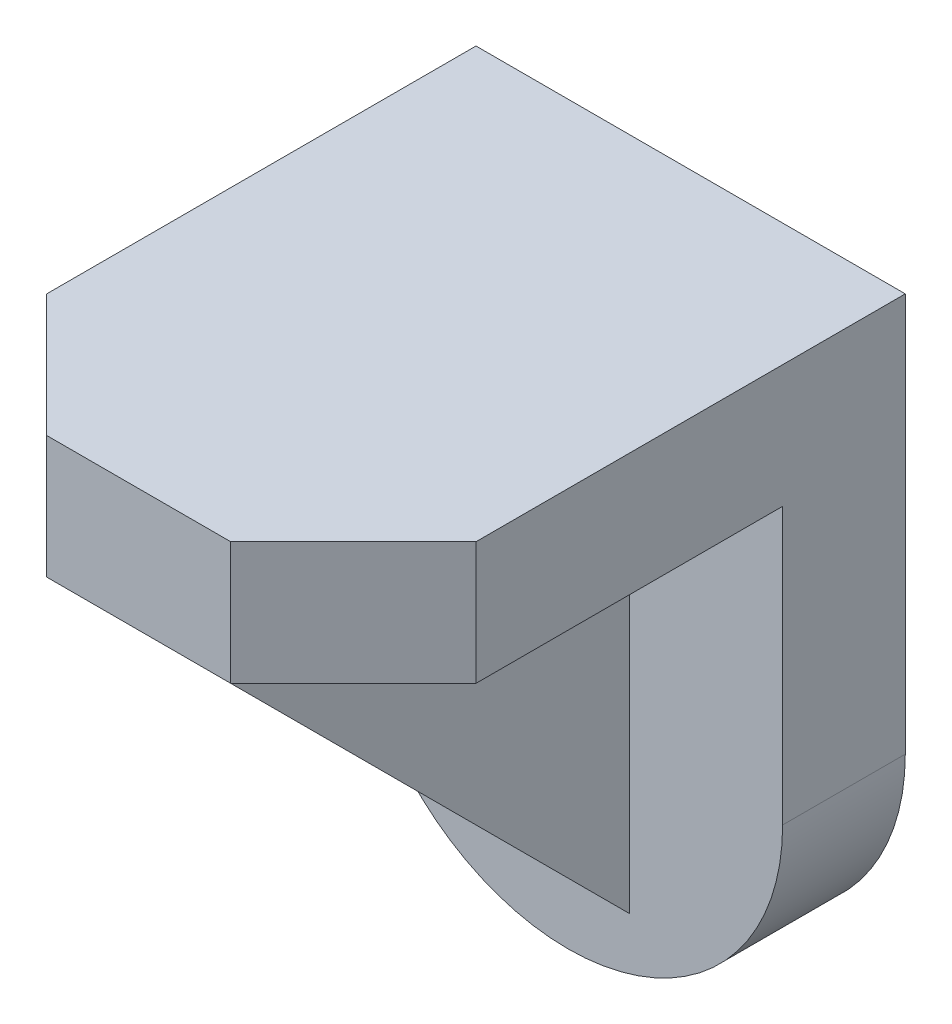
ISO-10303-21;
HEADER;
FILE_DESCRIPTION(('STEP AP214'),'2;1');
FILE_NAME('part.step','',(''),(''),'','','');
FILE_SCHEMA(('AUTOMOTIVE_DESIGN { 1 0 10303 214 1 1 1 1 }'));
ENDSEC;
DATA;
#1=APPLICATION_CONTEXT('core data for automotive mechanical design processes');
#2=APPLICATION_PROTOCOL_DEFINITION('international standard','automotive_design',2000,#1);
#3=PRODUCT_CONTEXT('',#1,'mechanical');
#4=PRODUCT('Part','Part','',(#3));
#5=PRODUCT_RELATED_PRODUCT_CATEGORY('part','',(#4));
#6=PRODUCT_DEFINITION_FORMATION('','',#4);
#7=PRODUCT_DEFINITION_CONTEXT('part definition',#1,'design');
#8=PRODUCT_DEFINITION('design','',#6,#7);
#9=PRODUCT_DEFINITION_SHAPE('','',#8);
#10=(LENGTH_UNIT() NAMED_UNIT(*) SI_UNIT(.MILLI.,.METRE.));
#11=(NAMED_UNIT(*) PLANE_ANGLE_UNIT() SI_UNIT($,.RADIAN.));
#12=(NAMED_UNIT(*) SI_UNIT($,.STERADIAN.) SOLID_ANGLE_UNIT());
#13=UNCERTAINTY_MEASURE_WITH_UNIT(LENGTH_MEASURE(1.E-05),#10,'distance_accuracy_value','');
#14=(GEOMETRIC_REPRESENTATION_CONTEXT(3) GLOBAL_UNCERTAINTY_ASSIGNED_CONTEXT((#13)) GLOBAL_UNIT_ASSIGNED_CONTEXT((#10,
#11,#12)) REPRESENTATION_CONTEXT('',''));
#15=CARTESIAN_POINT('',(0.,0.,0.));
#16=DIRECTION('',(0.,0.,1.));
#17=DIRECTION('',(1.,0.,0.));
#18=AXIS2_PLACEMENT_3D('',#15,#16,#17);
#19=CARTESIAN_POINT('',(0.,0.,0.));
#20=DIRECTION('',(0.,1.,0.));
#21=DIRECTION('',(0.,0.,1.));
#22=AXIS2_PLACEMENT_3D('',#19,#20,#21);
#23=PLANE('',#22);
#24=DIRECTION('',(0.,0.,1.));
#25=VECTOR('',#24,1.);
#26=CARTESIAN_POINT('',(6.,0.,27.));
#27=LINE('',#26,#25);
#28=CARTESIAN_POINT('',(6.,0.,-15.));
#29=VERTEX_POINT('',#28);
#30=CARTESIAN_POINT('',(6.,0.,27.));
#31=VERTEX_POINT('',#30);
#32=EDGE_CURVE('E128',#29,#31,#27,.T.);
#33=ORIENTED_EDGE('',*,*,#32,.F.);
#34=DIRECTION('',(1.,0.,0.));
#35=VECTOR('',#34,1.);
#36=CARTESIAN_POINT('',(21.,0.,-15.));
#37=LINE('',#36,#35);
#38=CARTESIAN_POINT('',(21.,0.,-15.));
#39=VERTEX_POINT('',#38);
#40=EDGE_CURVE('E62',#29,#39,#37,.T.);
#41=ORIENTED_EDGE('',*,*,#40,.T.);
#42=DIRECTION('',(0.,0.,-1.));
#43=VECTOR('',#42,1.);
#44=CARTESIAN_POINT('',(21.,0.,-27.));
#45=LINE('',#44,#43);
#46=CARTESIAN_POINT('',(21.,0.,14.9999999999999));
#47=VERTEX_POINT('',#46);
#48=EDGE_CURVE('E168',#47,#39,#45,.T.);
#49=ORIENTED_EDGE('',*,*,#48,.F.);
#50=DIRECTION('',(0.707106781186548,0.,-0.707106781186548));
#51=VECTOR('',#50,1.);
#52=CARTESIAN_POINT('',(21.,0.,14.9999999999999));
#53=LINE('',#52,#51);
#54=CARTESIAN_POINT('',(8.99999999999994,0.,27.));
#55=VERTEX_POINT('',#54);
#56=EDGE_CURVE('E199',#47,#55,#53,.F.);
#57=ORIENTED_EDGE('',*,*,#56,.T.);
#58=DIRECTION('',(1.,0.,0.));
#59=VECTOR('',#58,1.);
#60=CARTESIAN_POINT('',(-21.,0.,27.));
#61=LINE('',#60,#59);
#62=EDGE_CURVE('E187',#31,#55,#61,.T.);
#63=ORIENTED_EDGE('',*,*,#62,.F.);
#64=EDGE_LOOP('',(#33,#41,#49,#57,#63));
#65=FACE_BOUND('',#64,.T.);
#66=ADVANCED_FACE('F38',(#65),#23,.F.);
#67=CARTESIAN_POINT('',(0.,-27.,-15.));
#68=DIRECTION('',(0.,0.,-1.));
#69=DIRECTION('',(-1.,0.,0.));
#70=AXIS2_PLACEMENT_3D('',#67,#68,#69);
#71=PLANE('',#70);
#72=DIRECTION('',(0.,1.,0.));
#73=VECTOR('',#72,1.);
#74=CARTESIAN_POINT('',(6.,-42.,-15.));
#75=LINE('',#74,#73);
#76=CARTESIAN_POINT('',(6.,-42.,-15.));
#77=VERTEX_POINT('',#76);
#78=EDGE_CURVE('E127',#77,#29,#75,.T.);
#79=ORIENTED_EDGE('',*,*,#78,.F.);
#80=DIRECTION('',(-1.,0.,0.));
#81=VECTOR('',#80,1.);
#82=CARTESIAN_POINT('',(6.,-42.,-15.));
#83=LINE('',#82,#81);
#84=CARTESIAN_POINT('',(-6.,-42.,-15.));
#85=VERTEX_POINT('',#84);
#86=EDGE_CURVE('E134',#77,#85,#83,.T.);
#87=ORIENTED_EDGE('',*,*,#86,.T.);
#88=DIRECTION('',(0.,1.,0.));
#89=VECTOR('',#88,1.);
#90=CARTESIAN_POINT('',(-6.,-42.,-15.));
#91=LINE('',#90,#89);
#92=CARTESIAN_POINT('',(-5.99999999999999,0.,-15.));
#93=VERTEX_POINT('',#92);
#94=EDGE_CURVE('E146',#85,#93,#91,.T.);
#95=ORIENTED_EDGE('',*,*,#94,.T.);
#96=CARTESIAN_POINT('',(-21.,0.,-15.));
#97=VERTEX_POINT('',#96);
#98=EDGE_CURVE('E150',#97,#93,#37,.T.);
#99=ORIENTED_EDGE('',*,*,#98,.F.);
#100=DIRECTION('',(0.,1.,0.));
#101=VECTOR('',#100,1.);
#102=CARTESIAN_POINT('',(-21.,0.,-15.));
#103=LINE('',#102,#101);
#104=CARTESIAN_POINT('',(-21.,-27.,-15.));
#105=VERTEX_POINT('',#104);
#106=EDGE_CURVE('E159',#105,#97,#103,.T.);
#107=ORIENTED_EDGE('',*,*,#106,.F.);
#108=CARTESIAN_POINT('',(0.,-27.,-15.));
#109=DIRECTION('',(0.,0.,-1.));
#110=DIRECTION('',(-1.,0.,0.));
#111=AXIS2_PLACEMENT_3D('',#108,#109,#110);
#112=CIRCLE('',#111,21.);
#113=CARTESIAN_POINT('',(21.,-27.,-15.));
#114=VERTEX_POINT('',#113);
#115=EDGE_CURVE('E156',#114,#105,#112,.T.);
#116=ORIENTED_EDGE('',*,*,#115,.F.);
#117=DIRECTION('',(0.,-1.,0.));
#118=VECTOR('',#117,1.);
#119=CARTESIAN_POINT('',(21.,0.,-15.));
#120=LINE('',#119,#118);
#121=EDGE_CURVE('E153',#39,#114,#120,.T.);
#122=ORIENTED_EDGE('',*,*,#121,.F.);
#123=ORIENTED_EDGE('',*,*,#40,.F.);
#124=EDGE_LOOP('',(#79,#87,#95,#99,#107,#116,#122,#123));
#125=FACE_BOUND('',#124,.T.);
#126=ADVANCED_FACE('F141',(#125),#71,.F.);
#127=CARTESIAN_POINT('',(21.,12.,-27.));
#128=DIRECTION('',(-1.,0.,0.));
#129=DIRECTION('',(0.,0.,1.));
#130=AXIS2_PLACEMENT_3D('',#127,#128,#129);
#131=PLANE('',#130);
#132=DIRECTION('',(0.,0.,-1.));
#133=VECTOR('',#132,1.);
#134=CARTESIAN_POINT('',(21.,12.,-27.));
#135=LINE('',#134,#133);
#136=CARTESIAN_POINT('',(21.,12.,14.9999999999999));
#137=VERTEX_POINT('',#136);
#138=CARTESIAN_POINT('',(21.,12.,-27.));
#139=VERTEX_POINT('',#138);
#140=EDGE_CURVE('E171',#137,#139,#135,.T.);
#141=ORIENTED_EDGE('',*,*,#140,.F.);
#142=DIRECTION('',(0.,-1.,0.));
#143=VECTOR('',#142,1.);
#144=CARTESIAN_POINT('',(21.,12.,14.9999999999999));
#145=LINE('',#144,#143);
#146=EDGE_CURVE('E193',#137,#47,#145,.T.);
#147=ORIENTED_EDGE('',*,*,#146,.T.);
#148=ORIENTED_EDGE('',*,*,#48,.T.);
#149=ORIENTED_EDGE('',*,*,#121,.T.);
#150=DIRECTION('',(0.,0.,-1.));
#151=VECTOR('',#150,1.);
#152=CARTESIAN_POINT('',(21.,-27.,-15.));
#153=LINE('',#152,#151);
#154=CARTESIAN_POINT('',(21.,-27.,-27.));
#155=VERTEX_POINT('',#154);
#156=EDGE_CURVE('E162',#114,#155,#153,.T.);
#157=ORIENTED_EDGE('',*,*,#156,.T.);
#158=DIRECTION('',(0.,-1.,0.));
#159=VECTOR('',#158,1.);
#160=CARTESIAN_POINT('',(21.,12.,-27.));
#161=LINE('',#160,#159);
#162=EDGE_CURVE('E191',#139,#155,#161,.T.);
#163=ORIENTED_EDGE('',*,*,#162,.F.);
#164=EDGE_LOOP('',(#141,#147,#148,#149,#157,#163));
#165=FACE_BOUND('',#164,.T.);
#166=ADVANCED_FACE('F219',(#165),#131,.F.);
#167=CARTESIAN_POINT('',(-21.,12.,-27.));
#168=DIRECTION('',(0.,0.,1.));
#169=DIRECTION('',(1.,0.,0.));
#170=AXIS2_PLACEMENT_3D('',#167,#168,#169);
#171=PLANE('',#170);
#172=ORIENTED_EDGE('',*,*,#162,.T.);
#173=CARTESIAN_POINT('',(0.,-27.,-27.));
#174=DIRECTION('',(0.,0.,-1.));
#175=DIRECTION('',(-1.,0.,0.));
#176=AXIS2_PLACEMENT_3D('',#173,#174,#175);
#177=CIRCLE('',#176,21.);
#178=CARTESIAN_POINT('',(-21.,-27.,-27.));
#179=VERTEX_POINT('',#178);
#180=EDGE_CURVE('E138',#155,#179,#177,.T.);
#181=ORIENTED_EDGE('',*,*,#180,.T.);
#182=DIRECTION('',(0.,-1.,0.));
#183=VECTOR('',#182,1.);
#184=CARTESIAN_POINT('',(-21.,12.,-27.));
#185=LINE('',#184,#183);
#186=CARTESIAN_POINT('',(-21.,12.,-27.));
#187=VERTEX_POINT('',#186);
#188=EDGE_CURVE('E182',#187,#179,#185,.T.);
#189=ORIENTED_EDGE('',*,*,#188,.F.);
#190=DIRECTION('',(-1.,0.,0.));
#191=VECTOR('',#190,1.);
#192=CARTESIAN_POINT('',(-21.,12.,-27.));
#193=LINE('',#192,#191);
#194=EDGE_CURVE('E173',#139,#187,#193,.T.);
#195=ORIENTED_EDGE('',*,*,#194,.F.);
#196=EDGE_LOOP('',(#172,#181,#189,#195));
#197=FACE_BOUND('',#196,.T.);
#198=ADVANCED_FACE('F229',(#197),#171,.F.);
#199=CARTESIAN_POINT('',(-21.,12.,-27.));
#200=DIRECTION('',(1.,0.,0.));
#201=DIRECTION('',(0.,0.,-1.));
#202=AXIS2_PLACEMENT_3D('',#199,#200,#201);
#203=PLANE('',#202);
#204=ORIENTED_EDGE('',*,*,#188,.T.);
#205=DIRECTION('',(0.,0.,-1.));
#206=VECTOR('',#205,1.);
#207=CARTESIAN_POINT('',(-21.,-27.,-15.));
#208=LINE('',#207,#206);
#209=EDGE_CURVE('E165',#105,#179,#208,.T.);
#210=ORIENTED_EDGE('',*,*,#209,.F.);
#211=ORIENTED_EDGE('',*,*,#106,.T.);
#212=DIRECTION('',(0.,0.,1.));
#213=VECTOR('',#212,1.);
#214=CARTESIAN_POINT('',(-21.,0.,-27.));
#215=LINE('',#214,#213);
#216=CARTESIAN_POINT('',(-21.,0.,14.9999999999999));
#217=VERTEX_POINT('',#216);
#218=EDGE_CURVE('E185',#97,#217,#215,.T.);
#219=ORIENTED_EDGE('',*,*,#218,.T.);
#220=DIRECTION('',(0.,1.,0.));
#221=VECTOR('',#220,1.);
#222=CARTESIAN_POINT('',(-21.,12.,14.9999999999999));
#223=LINE('',#222,#221);
#224=CARTESIAN_POINT('',(-21.,12.,14.9999999999999));
#225=VERTEX_POINT('',#224);
#226=EDGE_CURVE('E11',#217,#225,#223,.T.);
#227=ORIENTED_EDGE('',*,*,#226,.T.);
#228=DIRECTION('',(0.,0.,1.));
#229=VECTOR('',#228,1.);
#230=CARTESIAN_POINT('',(-21.,12.,-27.));
#231=LINE('',#230,#229);
#232=EDGE_CURVE('E176',#187,#225,#231,.T.);
#233=ORIENTED_EDGE('',*,*,#232,.F.);
#234=EDGE_LOOP('',(#204,#210,#211,#219,#227,#233));
#235=FACE_BOUND('',#234,.T.);
#236=ADVANCED_FACE('F242',(#235),#203,.F.);
#237=CARTESIAN_POINT('',(-21.,12.,27.));
#238=DIRECTION('',(0.,0.,-1.));
#239=DIRECTION('',(-1.,0.,0.));
#240=AXIS2_PLACEMENT_3D('',#237,#238,#239);
#241=PLANE('',#240);
#242=CARTESIAN_POINT('',(-8.99999999999995,0.,27.));
#243=VERTEX_POINT('',#242);
#244=CARTESIAN_POINT('',(-6.,0.,27.));
#245=VERTEX_POINT('',#244);
#246=EDGE_CURVE('E174',#243,#245,#61,.T.);
#247=ORIENTED_EDGE('',*,*,#246,.T.);
#248=DIRECTION('',(-1.,0.,0.));
#249=VECTOR('',#248,1.);
#250=CARTESIAN_POINT('',(6.,0.,27.));
#251=LINE('',#250,#249);
#252=EDGE_CURVE('E139',#31,#245,#251,.T.);
#253=ORIENTED_EDGE('',*,*,#252,.F.);
#254=ORIENTED_EDGE('',*,*,#62,.T.);
#255=DIRECTION('',(0.,1.,0.));
#256=VECTOR('',#255,1.);
#257=CARTESIAN_POINT('',(8.99999999999995,12.,27.));
#258=LINE('',#257,#256);
#259=CARTESIAN_POINT('',(8.99999999999994,12.,27.));
#260=VERTEX_POINT('',#259);
#261=EDGE_CURVE('E205',#55,#260,#258,.T.);
#262=ORIENTED_EDGE('',*,*,#261,.T.);
#263=DIRECTION('',(1.,0.,0.));
#264=VECTOR('',#263,1.);
#265=CARTESIAN_POINT('',(-21.,12.,27.));
#266=LINE('',#265,#264);
#267=CARTESIAN_POINT('',(-8.99999999999995,12.,27.));
#268=VERTEX_POINT('',#267);
#269=EDGE_CURVE('E179',#268,#260,#266,.T.);
#270=ORIENTED_EDGE('',*,*,#269,.F.);
#271=DIRECTION('',(0.,-1.,0.));
#272=VECTOR('',#271,1.);
#273=CARTESIAN_POINT('',(-8.99999999999995,12.,27.));
#274=LINE('',#273,#272);
#275=EDGE_CURVE('E202',#268,#243,#274,.T.);
#276=ORIENTED_EDGE('',*,*,#275,.T.);
#277=EDGE_LOOP('',(#247,#253,#254,#262,#270,#276));
#278=FACE_BOUND('',#277,.T.);
#279=ADVANCED_FACE('F238',(#278),#241,.F.);
#280=CARTESIAN_POINT('',(0.,12.,0.));
#281=DIRECTION('',(0.,1.,0.));
#282=DIRECTION('',(0.,0.,1.));
#283=AXIS2_PLACEMENT_3D('',#280,#281,#282);
#284=PLANE('',#283);
#285=ORIENTED_EDGE('',*,*,#269,.T.);
#286=DIRECTION('',(-0.707106781186548,0.,0.707106781186548));
#287=VECTOR('',#286,1.);
#288=CARTESIAN_POINT('',(18.,12.,18.));
#289=LINE('',#288,#287);
#290=EDGE_CURVE('E47',#260,#137,#289,.F.);
#291=ORIENTED_EDGE('',*,*,#290,.T.);
#292=ORIENTED_EDGE('',*,*,#140,.T.);
#293=ORIENTED_EDGE('',*,*,#194,.T.);
#294=ORIENTED_EDGE('',*,*,#232,.T.);
#295=DIRECTION('',(-0.707106781186548,0.,-0.707106781186548));
#296=VECTOR('',#295,1.);
#297=CARTESIAN_POINT('',(-18.,12.,18.));
#298=LINE('',#297,#296);
#299=EDGE_CURVE('E207',#225,#268,#298,.F.);
#300=ORIENTED_EDGE('',*,*,#299,.T.);
#301=EDGE_LOOP('',(#285,#291,#292,#293,#294,#300));
#302=FACE_BOUND('',#301,.T.);
#303=ADVANCED_FACE('F211',(#302),#284,.T.);
#304=ORIENTED_EDGE('',*,*,#98,.T.);
#305=DIRECTION('',(0.,0.,1.));
#306=VECTOR('',#305,1.);
#307=CARTESIAN_POINT('',(-6.,0.,27.));
#308=LINE('',#307,#306);
#309=EDGE_CURVE('E54',#93,#245,#308,.T.);
#310=ORIENTED_EDGE('',*,*,#309,.T.);
#311=ORIENTED_EDGE('',*,*,#246,.F.);
#312=DIRECTION('',(0.707106781186548,0.,0.707106781186548));
#313=VECTOR('',#312,1.);
#314=CARTESIAN_POINT('',(-8.99999999999995,0.,27.));
#315=LINE('',#314,#313);
#316=EDGE_CURVE('E196',#243,#217,#315,.F.);
#317=ORIENTED_EDGE('',*,*,#316,.T.);
#318=ORIENTED_EDGE('',*,*,#218,.F.);
#319=EDGE_LOOP('',(#304,#310,#311,#317,#318));
#320=FACE_BOUND('',#319,.T.);
#321=ADVANCED_FACE('F240',(#320),#23,.F.);
#322=CARTESIAN_POINT('',(21.,12.,14.9999999999999));
#323=DIRECTION('',(-0.707106781186547,0.,-0.707106781186547));
#324=DIRECTION('',(0.,-1.,0.));
#325=AXIS2_PLACEMENT_3D('',#322,#323,#324);
#326=PLANE('',#325);
#327=ORIENTED_EDGE('',*,*,#290,.F.);
#328=ORIENTED_EDGE('',*,*,#261,.F.);
#329=ORIENTED_EDGE('',*,*,#56,.F.);
#330=ORIENTED_EDGE('',*,*,#146,.F.);
#331=EDGE_LOOP('',(#327,#328,#329,#330));
#332=FACE_BOUND('',#331,.T.);
#333=ADVANCED_FACE('F220',(#332),#326,.F.);
#334=CARTESIAN_POINT('',(-8.99999999999995,12.,27.));
#335=DIRECTION('',(0.707106781186547,0.,-0.707106781186547));
#336=DIRECTION('',(0.,-1.,0.));
#337=AXIS2_PLACEMENT_3D('',#334,#335,#336);
#338=PLANE('',#337);
#339=ORIENTED_EDGE('',*,*,#299,.F.);
#340=ORIENTED_EDGE('',*,*,#226,.F.);
#341=ORIENTED_EDGE('',*,*,#316,.F.);
#342=ORIENTED_EDGE('',*,*,#275,.F.);
#343=EDGE_LOOP('',(#339,#340,#341,#342));
#344=FACE_BOUND('',#343,.T.);
#345=ADVANCED_FACE('F41',(#344),#338,.F.);
#346=CARTESIAN_POINT('',(0.,-27.,-15.));
#347=DIRECTION('',(0.,0.,-1.));
#348=DIRECTION('',(-1.,0.,0.));
#349=AXIS2_PLACEMENT_3D('',#346,#347,#348);
#350=CYLINDRICAL_SURFACE('',#349,21.);
#351=ORIENTED_EDGE('',*,*,#180,.F.);
#352=ORIENTED_EDGE('',*,*,#156,.F.);
#353=ORIENTED_EDGE('',*,*,#115,.T.);
#354=ORIENTED_EDGE('',*,*,#209,.T.);
#355=EDGE_LOOP('',(#351,#352,#353,#354));
#356=FACE_BOUND('',#355,.T.);
#357=ADVANCED_FACE('F226',(#356),#350,.T.);
#358=CARTESIAN_POINT('',(6.,-42.,-15.));
#359=DIRECTION('',(0.,0.707106781186547,-0.707106781186548));
#360=DIRECTION('',(0.,0.707106781186548,0.707106781186547));
#361=AXIS2_PLACEMENT_3D('',#358,#359,#360);
#362=PLANE('',#361);
#363=DIRECTION('',(0.,-0.707106781186548,-0.707106781186547));
#364=VECTOR('',#363,1.);
#365=CARTESIAN_POINT('',(-6.,-42.,-15.));
#366=LINE('',#365,#364);
#367=EDGE_CURVE('E136',#245,#85,#366,.T.);
#368=ORIENTED_EDGE('',*,*,#367,.T.);
#369=ORIENTED_EDGE('',*,*,#86,.F.);
#370=DIRECTION('',(0.,-0.707106781186548,-0.707106781186547));
#371=VECTOR('',#370,1.);
#372=CARTESIAN_POINT('',(6.,-42.,-15.));
#373=LINE('',#372,#371);
#374=EDGE_CURVE('E123',#31,#77,#373,.T.);
#375=ORIENTED_EDGE('',*,*,#374,.F.);
#376=ORIENTED_EDGE('',*,*,#252,.T.);
#377=EDGE_LOOP('',(#368,#369,#375,#376));
#378=FACE_BOUND('',#377,.T.);
#379=ADVANCED_FACE('F135',(#378),#362,.F.);
#380=CARTESIAN_POINT('',(6.,0.,0.));
#381=DIRECTION('',(-1.,0.,0.));
#382=DIRECTION('',(0.,0.,1.));
#383=AXIS2_PLACEMENT_3D('',#380,#381,#382);
#384=PLANE('',#383);
#385=ORIENTED_EDGE('',*,*,#374,.T.);
#386=ORIENTED_EDGE('',*,*,#78,.T.);
#387=ORIENTED_EDGE('',*,*,#32,.T.);
#388=EDGE_LOOP('',(#385,#386,#387));
#389=FACE_BOUND('',#388,.T.);
#390=ADVANCED_FACE('F125',(#389),#384,.F.);
#391=CARTESIAN_POINT('',(-6.,0.,0.));
#392=DIRECTION('',(-1.,0.,0.));
#393=DIRECTION('',(0.,0.,1.));
#394=AXIS2_PLACEMENT_3D('',#391,#392,#393);
#395=PLANE('',#394);
#396=ORIENTED_EDGE('',*,*,#367,.F.);
#397=ORIENTED_EDGE('',*,*,#309,.F.);
#398=ORIENTED_EDGE('',*,*,#94,.F.);
#399=EDGE_LOOP('',(#396,#397,#398));
#400=FACE_BOUND('',#399,.T.);
#401=ADVANCED_FACE('F270',(#400),#395,.T.);
#402=CLOSED_SHELL('',(#66,#126,#166,#198,#236,#279,#303,#321,#333,#345,#357,#379,#390,#401));
#403=MANIFOLD_SOLID_BREP('B2',#402);
#404=ADVANCED_BREP_SHAPE_REPRESENTATION('',(#18,#403),#14);
#405=SHAPE_DEFINITION_REPRESENTATION(#9,#404);
ENDSEC;
END-ISO-10303-21;
